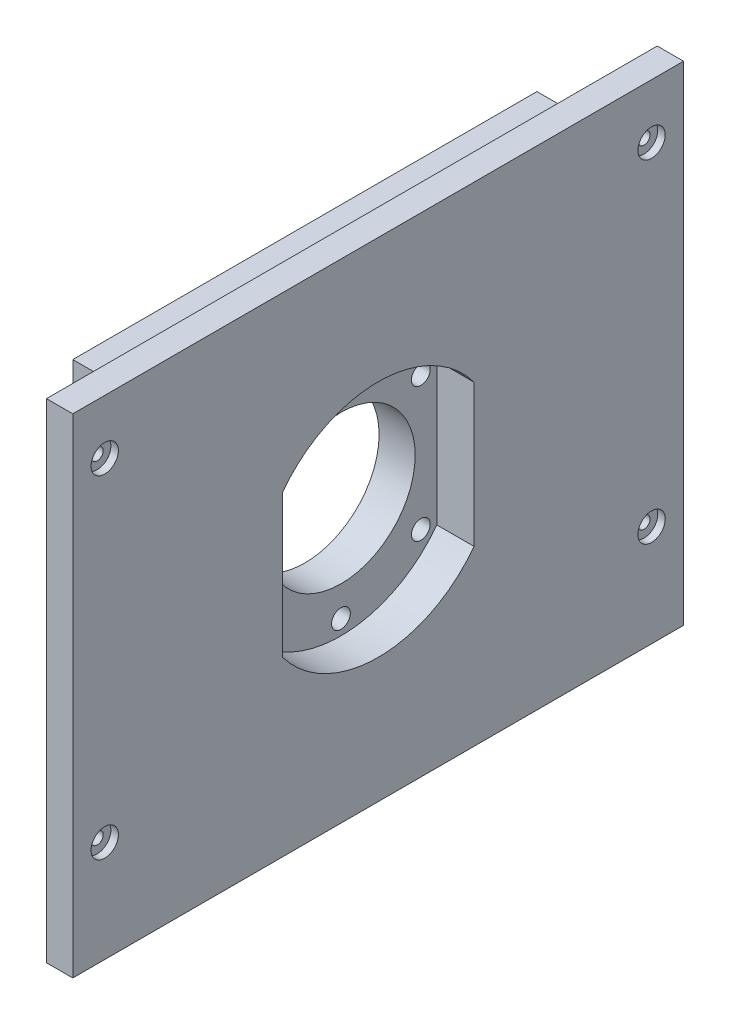
ISO-10303-21;
HEADER;
FILE_DESCRIPTION(('STEP AP214'),'2;1');
FILE_NAME('part.step','',(''),(''),'','','');
FILE_SCHEMA(('AUTOMOTIVE_DESIGN { 1 0 10303 214 1 1 1 1 }'));
ENDSEC;
DATA;
#1=APPLICATION_CONTEXT('core data for automotive mechanical design processes');
#2=APPLICATION_PROTOCOL_DEFINITION('international standard','automotive_design',2000,#1);
#3=PRODUCT_CONTEXT('',#1,'mechanical');
#4=PRODUCT('Part','Part','',(#3));
#5=PRODUCT_RELATED_PRODUCT_CATEGORY('part','',(#4));
#6=PRODUCT_DEFINITION_FORMATION('','',#4);
#7=PRODUCT_DEFINITION_CONTEXT('part definition',#1,'design');
#8=PRODUCT_DEFINITION('design','',#6,#7);
#9=PRODUCT_DEFINITION_SHAPE('','',#8);
#10=(LENGTH_UNIT() NAMED_UNIT(*) SI_UNIT(.MILLI.,.METRE.));
#11=(NAMED_UNIT(*) PLANE_ANGLE_UNIT() SI_UNIT($,.RADIAN.));
#12=(NAMED_UNIT(*) SI_UNIT($,.STERADIAN.) SOLID_ANGLE_UNIT());
#13=UNCERTAINTY_MEASURE_WITH_UNIT(LENGTH_MEASURE(1.E-05),#10,'distance_accuracy_value','');
#14=(GEOMETRIC_REPRESENTATION_CONTEXT(3) GLOBAL_UNCERTAINTY_ASSIGNED_CONTEXT((#13)) GLOBAL_UNIT_ASSIGNED_CONTEXT((#10,
#11,#12)) REPRESENTATION_CONTEXT('',''));
#15=CARTESIAN_POINT('',(0.,0.,0.));
#16=DIRECTION('',(0.,0.,1.));
#17=DIRECTION('',(1.,0.,0.));
#18=AXIS2_PLACEMENT_3D('',#15,#16,#17);
#19=CARTESIAN_POINT('',(39.,130.,150.));
#20=DIRECTION('',(0.,0.,-1.));
#21=DIRECTION('',(-1.,0.,0.));
#22=AXIS2_PLACEMENT_3D('',#19,#20,#21);
#23=PLANE('',#22);
#24=DIRECTION('',(0.,-1.,0.));
#25=VECTOR('',#24,1.);
#26=CARTESIAN_POINT('',(25.,-130.,150.));
#27=LINE('',#26,#25);
#28=CARTESIAN_POINT('',(25.,130.,150.));
#29=VERTEX_POINT('',#28);
#30=CARTESIAN_POINT('',(25.,-130.,150.));
#31=VERTEX_POINT('',#30);
#32=EDGE_CURVE('E191',#29,#31,#27,.T.);
#33=ORIENTED_EDGE('',*,*,#32,.T.);
#34=DIRECTION('',(-1.,0.,0.));
#35=VECTOR('',#34,1.);
#36=CARTESIAN_POINT('',(39.,-130.,150.));
#37=LINE('',#36,#35);
#38=CARTESIAN_POINT('',(39.,-130.,150.));
#39=VERTEX_POINT('',#38);
#40=EDGE_CURVE('E61',#39,#31,#37,.T.);
#41=ORIENTED_EDGE('',*,*,#40,.F.);
#42=DIRECTION('',(0.,-1.,0.));
#43=VECTOR('',#42,1.);
#44=CARTESIAN_POINT('',(39.,130.,150.));
#45=LINE('',#44,#43);
#46=CARTESIAN_POINT('',(39.,130.,150.));
#47=VERTEX_POINT('',#46);
#48=EDGE_CURVE('E304',#47,#39,#45,.T.);
#49=ORIENTED_EDGE('',*,*,#48,.F.);
#50=DIRECTION('',(-1.,0.,0.));
#51=VECTOR('',#50,1.);
#52=CARTESIAN_POINT('',(39.,130.,150.));
#53=LINE('',#52,#51);
#54=EDGE_CURVE('E313',#47,#29,#53,.T.);
#55=ORIENTED_EDGE('',*,*,#54,.T.);
#56=EDGE_LOOP('',(#33,#41,#49,#55));
#57=FACE_BOUND('',#56,.T.);
#58=ADVANCED_FACE('F54',(#57),#23,.F.);
#59=CARTESIAN_POINT('',(39.,-130.,150.));
#60=DIRECTION('',(0.,1.,0.));
#61=DIRECTION('',(0.,0.,1.));
#62=AXIS2_PLACEMENT_3D('',#59,#60,#61);
#63=PLANE('',#62);
#64=ORIENTED_EDGE('',*,*,#40,.T.);
#65=DIRECTION('',(0.,0.,-1.));
#66=VECTOR('',#65,1.);
#67=CARTESIAN_POINT('',(25.,-130.,-175.));
#68=LINE('',#67,#66);
#69=CARTESIAN_POINT('',(25.,-130.,-175.));
#70=VERTEX_POINT('',#69);
#71=EDGE_CURVE('E195',#31,#70,#68,.T.);
#72=ORIENTED_EDGE('',*,*,#71,.T.);
#73=DIRECTION('',(-1.,0.,0.));
#74=VECTOR('',#73,1.);
#75=CARTESIAN_POINT('',(39.,-130.,-175.));
#76=LINE('',#75,#74);
#77=CARTESIAN_POINT('',(39.,-130.,-175.));
#78=VERTEX_POINT('',#77);
#79=EDGE_CURVE('E319',#78,#70,#76,.T.);
#80=ORIENTED_EDGE('',*,*,#79,.F.);
#81=DIRECTION('',(0.,0.,-1.));
#82=VECTOR('',#81,1.);
#83=CARTESIAN_POINT('',(39.,-130.,150.));
#84=LINE('',#83,#82);
#85=EDGE_CURVE('E307',#39,#78,#84,.T.);
#86=ORIENTED_EDGE('',*,*,#85,.F.);
#87=EDGE_LOOP('',(#64,#72,#80,#86));
#88=FACE_BOUND('',#87,.T.);
#89=ADVANCED_FACE('F364',(#88),#63,.F.);
#90=CARTESIAN_POINT('',(39.,130.,150.));
#91=DIRECTION('',(0.,-1.,0.));
#92=DIRECTION('',(0.,0.,-1.));
#93=AXIS2_PLACEMENT_3D('',#90,#91,#92);
#94=PLANE('',#93);
#95=DIRECTION('',(0.,0.,1.));
#96=VECTOR('',#95,1.);
#97=CARTESIAN_POINT('',(25.,130.,-175.));
#98=LINE('',#97,#96);
#99=CARTESIAN_POINT('',(25.,130.,-175.));
#100=VERTEX_POINT('',#99);
#101=EDGE_CURVE('E188',#100,#29,#98,.T.);
#102=ORIENTED_EDGE('',*,*,#101,.T.);
#103=ORIENTED_EDGE('',*,*,#54,.F.);
#104=DIRECTION('',(0.,0.,1.));
#105=VECTOR('',#104,1.);
#106=CARTESIAN_POINT('',(39.,130.,150.));
#107=LINE('',#106,#105);
#108=CARTESIAN_POINT('',(39.,130.,-175.));
#109=VERTEX_POINT('',#108);
#110=EDGE_CURVE('E311',#109,#47,#107,.T.);
#111=ORIENTED_EDGE('',*,*,#110,.F.);
#112=DIRECTION('',(-1.,0.,0.));
#113=VECTOR('',#112,1.);
#114=CARTESIAN_POINT('',(39.,130.,-175.));
#115=LINE('',#114,#113);
#116=EDGE_CURVE('E316',#109,#100,#115,.T.);
#117=ORIENTED_EDGE('',*,*,#116,.T.);
#118=EDGE_LOOP('',(#102,#103,#111,#117));
#119=FACE_BOUND('',#118,.T.);
#120=ADVANCED_FACE('F371',(#119),#94,.F.);
#121=CARTESIAN_POINT('',(0.,0.,0.));
#122=DIRECTION('',(1.,0.,0.));
#123=DIRECTION('',(0.,0.,-1.));
#124=AXIS2_PLACEMENT_3D('',#121,#122,#123);
#125=PLANE('',#124);
#126=CARTESIAN_POINT('',(0.,0.,-12.5));
#127=DIRECTION('',(1.,0.,0.));
#128=DIRECTION('',(0.,0.,-1.));
#129=AXIS2_PLACEMENT_3D('',#126,#127,#128);
#130=CIRCLE('',#129,39.51);
#131=CARTESIAN_POINT('',(0.,0.,-52.01));
#132=VERTEX_POINT('',#131);
#133=EDGE_CURVE('E265',#132,#132,#130,.T.);
#134=ORIENTED_EDGE('',*,*,#133,.T.);
#135=EDGE_LOOP('',(#134));
#136=FACE_BOUND('',#135,.T.);
#137=DIRECTION('',(0.,1.,0.));
#138=VECTOR('',#137,1.);
#139=CARTESIAN_POINT('',(0.,-130.,111.));
#140=LINE('',#139,#138);
#141=CARTESIAN_POINT('',(0.,-116.,111.));
#142=VERTEX_POINT('',#141);
#143=CARTESIAN_POINT('',(0.,116.,111.));
#144=VERTEX_POINT('',#143);
#145=EDGE_CURVE('E180',#142,#144,#140,.T.);
#146=ORIENTED_EDGE('',*,*,#145,.T.);
#147=DIRECTION('',(0.,0.,1.));
#148=VECTOR('',#147,1.);
#149=CARTESIAN_POINT('',(0.,116.,-175.));
#150=LINE('',#149,#148);
#151=CARTESIAN_POINT('',(0.,116.,-136.));
#152=VERTEX_POINT('',#151);
#153=EDGE_CURVE('E67',#152,#144,#150,.T.);
#154=ORIENTED_EDGE('',*,*,#153,.F.);
#155=DIRECTION('',(0.,-1.,0.));
#156=VECTOR('',#155,1.);
#157=CARTESIAN_POINT('',(0.,-130.,-136.));
#158=LINE('',#157,#156);
#159=CARTESIAN_POINT('',(0.,-116.,-136.));
#160=VERTEX_POINT('',#159);
#161=EDGE_CURVE('E177',#152,#160,#158,.T.);
#162=ORIENTED_EDGE('',*,*,#161,.T.);
#163=DIRECTION('',(0.,0.,-1.));
#164=VECTOR('',#163,1.);
#165=CARTESIAN_POINT('',(0.,-116.,-136.));
#166=LINE('',#165,#164);
#167=EDGE_CURVE('E394',#142,#160,#166,.T.);
#168=ORIENTED_EDGE('',*,*,#167,.F.);
#169=EDGE_LOOP('',(#146,#154,#162,#168));
#170=FACE_BOUND('',#169,.T.);
#171=ADVANCED_FACE('F175',(#136,#170),#125,.F.);
#172=CARTESIAN_POINT('',(39.,-76.,133.));
#173=DIRECTION('',(1.,0.,0.));
#174=DIRECTION('',(0.,0.,-1.));
#175=AXIS2_PLACEMENT_3D('',#172,#173,#174);
#176=CYLINDRICAL_SURFACE('',#175,3.19999999999999);
#177=CARTESIAN_POINT('',(35.,-76.,133.));
#178=DIRECTION('',(1.,0.,0.));
#179=DIRECTION('',(0.,0.,-1.));
#180=AXIS2_PLACEMENT_3D('',#177,#178,#179);
#181=CIRCLE('',#180,3.19999999999999);
#182=CARTESIAN_POINT('',(35.,-76.,129.8));
#183=VERTEX_POINT('',#182);
#184=EDGE_CURVE('E301',#183,#183,#181,.T.);
#185=ORIENTED_EDGE('',*,*,#184,.T.);
#186=EDGE_LOOP('',(#185));
#187=FACE_BOUND('',#186,.T.);
#188=CARTESIAN_POINT('',(25.,-76.,133.));
#189=DIRECTION('',(-1.,0.,0.));
#190=DIRECTION('',(0.,0.,1.));
#191=AXIS2_PLACEMENT_3D('',#188,#189,#190);
#192=CIRCLE('',#191,3.19999999999999);
#193=CARTESIAN_POINT('',(25.,-76.,136.2));
#194=VERTEX_POINT('',#193);
#195=EDGE_CURVE('E205',#194,#194,#192,.F.);
#196=ORIENTED_EDGE('',*,*,#195,.F.);
#197=EDGE_LOOP('',(#196));
#198=FACE_BOUND('',#197,.T.);
#199=ADVANCED_FACE('F348',(#187,#198),#176,.F.);
#200=CARTESIAN_POINT('',(39.,101.,133.));
#201=DIRECTION('',(1.,0.,0.));
#202=DIRECTION('',(0.,0.,-1.));
#203=AXIS2_PLACEMENT_3D('',#200,#201,#202);
#204=CYLINDRICAL_SURFACE('',#203,3.19999999999999);
#205=CARTESIAN_POINT('',(35.,101.,133.));
#206=DIRECTION('',(1.,0.,0.));
#207=DIRECTION('',(0.,0.,-1.));
#208=AXIS2_PLACEMENT_3D('',#205,#206,#207);
#209=CIRCLE('',#208,3.19999999999999);
#210=CARTESIAN_POINT('',(35.,101.,129.8));
#211=VERTEX_POINT('',#210);
#212=EDGE_CURVE('E292',#211,#211,#209,.T.);
#213=ORIENTED_EDGE('',*,*,#212,.T.);
#214=EDGE_LOOP('',(#213));
#215=FACE_BOUND('',#214,.T.);
#216=CARTESIAN_POINT('',(25.,101.,133.));
#217=DIRECTION('',(-1.,0.,0.));
#218=DIRECTION('',(0.,0.,1.));
#219=AXIS2_PLACEMENT_3D('',#216,#217,#218);
#220=CIRCLE('',#219,3.19999999999999);
#221=CARTESIAN_POINT('',(25.,101.,136.2));
#222=VERTEX_POINT('',#221);
#223=EDGE_CURVE('E203',#222,#222,#220,.F.);
#224=ORIENTED_EDGE('',*,*,#223,.F.);
#225=EDGE_LOOP('',(#224));
#226=FACE_BOUND('',#225,.T.);
#227=ADVANCED_FACE('F345',(#215,#226),#204,.F.);
#228=CARTESIAN_POINT('',(39.,130.,-175.));
#229=DIRECTION('',(0.,0.,1.));
#230=DIRECTION('',(1.,0.,0.));
#231=AXIS2_PLACEMENT_3D('',#228,#229,#230);
#232=PLANE('',#231);
#233=ORIENTED_EDGE('',*,*,#79,.T.);
#234=DIRECTION('',(0.,1.,0.));
#235=VECTOR('',#234,1.);
#236=CARTESIAN_POINT('',(25.,-130.,-175.));
#237=LINE('',#236,#235);
#238=EDGE_CURVE('E185',#70,#100,#237,.T.);
#239=ORIENTED_EDGE('',*,*,#238,.T.);
#240=ORIENTED_EDGE('',*,*,#116,.F.);
#241=DIRECTION('',(0.,1.,0.));
#242=VECTOR('',#241,1.);
#243=CARTESIAN_POINT('',(39.,130.,-175.));
#244=LINE('',#243,#242);
#245=EDGE_CURVE('E309',#78,#109,#244,.T.);
#246=ORIENTED_EDGE('',*,*,#245,.F.);
#247=EDGE_LOOP('',(#233,#239,#240,#246));
#248=FACE_BOUND('',#247,.T.);
#249=ADVANCED_FACE('F347',(#248),#232,.F.);
#250=CARTESIAN_POINT('',(39.,0.,0.));
#251=DIRECTION('',(1.,0.,0.));
#252=DIRECTION('',(0.,0.,-1.));
#253=AXIS2_PLACEMENT_3D('',#250,#251,#252);
#254=PLANE('',#253);
#255=CARTESIAN_POINT('',(39.,0.0181351239460711,-12.5));
#256=DIRECTION('',(1.,0.,0.));
#257=DIRECTION('',(0.,0.,1.));
#258=AXIS2_PLACEMENT_3D('',#255,#256,#257);
#259=CIRCLE('',#258,63.5);
#260=CARTESIAN_POINT('',(39.,37.85,-63.5));
#261=VERTEX_POINT('',#260);
#262=CARTESIAN_POINT('',(39.,37.85,38.5));
#263=VERTEX_POINT('',#262);
#264=EDGE_CURVE('E246',#261,#263,#259,.T.);
#265=ORIENTED_EDGE('',*,*,#264,.F.);
#266=DIRECTION('',(0.,1.,0.));
#267=VECTOR('',#266,1.);
#268=CARTESIAN_POINT('',(39.,37.85,-63.5));
#269=LINE('',#268,#267);
#270=CARTESIAN_POINT('',(39.,-37.85,-63.5));
#271=VERTEX_POINT('',#270);
#272=EDGE_CURVE('E236',#271,#261,#269,.T.);
#273=ORIENTED_EDGE('',*,*,#272,.F.);
#274=CARTESIAN_POINT('',(39.,-0.0181351239460711,-12.5));
#275=DIRECTION('',(1.,0.,0.));
#276=DIRECTION('',(0.,0.,-1.));
#277=AXIS2_PLACEMENT_3D('',#274,#275,#276);
#278=CIRCLE('',#277,63.5);
#279=CARTESIAN_POINT('',(39.,-37.85,38.5));
#280=VERTEX_POINT('',#279);
#281=EDGE_CURVE('E251',#280,#271,#278,.T.);
#282=ORIENTED_EDGE('',*,*,#281,.F.);
#283=DIRECTION('',(0.,-1.,0.));
#284=VECTOR('',#283,1.);
#285=CARTESIAN_POINT('',(39.,37.85,38.5));
#286=LINE('',#285,#284);
#287=EDGE_CURVE('E248',#263,#280,#286,.T.);
#288=ORIENTED_EDGE('',*,*,#287,.F.);
#289=EDGE_LOOP('',(#265,#273,#282,#288));
#290=FACE_BOUND('',#289,.T.);
#291=CARTESIAN_POINT('',(39.,101.,-158.));
#292=DIRECTION('',(1.,0.,0.));
#293=DIRECTION('',(0.,0.,-1.));
#294=AXIS2_PLACEMENT_3D('',#291,#292,#293);
#295=CIRCLE('',#294,7.2735);
#296=CARTESIAN_POINT('',(39.,101.,-165.2735));
#297=VERTEX_POINT('',#296);
#298=EDGE_CURVE('E268',#297,#297,#295,.T.);
#299=ORIENTED_EDGE('',*,*,#298,.F.);
#300=EDGE_LOOP('',(#299));
#301=FACE_BOUND('',#300,.T.);
#302=CARTESIAN_POINT('',(39.,-76.,-158.));
#303=DIRECTION('',(1.,0.,0.));
#304=DIRECTION('',(0.,0.,-1.));
#305=AXIS2_PLACEMENT_3D('',#302,#303,#304);
#306=CIRCLE('',#305,7.2735);
#307=CARTESIAN_POINT('',(39.,-76.,-165.2735));
#308=VERTEX_POINT('',#307);
#309=EDGE_CURVE('E277',#308,#308,#306,.T.);
#310=ORIENTED_EDGE('',*,*,#309,.F.);
#311=EDGE_LOOP('',(#310));
#312=FACE_BOUND('',#311,.T.);
#313=CARTESIAN_POINT('',(39.,101.,133.));
#314=DIRECTION('',(1.,0.,0.));
#315=DIRECTION('',(0.,0.,-1.));
#316=AXIS2_PLACEMENT_3D('',#313,#314,#315);
#317=CIRCLE('',#316,7.2735);
#318=CARTESIAN_POINT('',(39.,101.,125.7265));
#319=VERTEX_POINT('',#318);
#320=EDGE_CURVE('E286',#319,#319,#317,.T.);
#321=ORIENTED_EDGE('',*,*,#320,.F.);
#322=EDGE_LOOP('',(#321));
#323=FACE_BOUND('',#322,.T.);
#324=CARTESIAN_POINT('',(39.,-76.,133.));
#325=DIRECTION('',(1.,0.,0.));
#326=DIRECTION('',(0.,0.,-1.));
#327=AXIS2_PLACEMENT_3D('',#324,#325,#326);
#328=CIRCLE('',#327,7.2735);
#329=CARTESIAN_POINT('',(39.,-76.,125.7265));
#330=VERTEX_POINT('',#329);
#331=EDGE_CURVE('E295',#330,#330,#328,.T.);
#332=ORIENTED_EDGE('',*,*,#331,.F.);
#333=EDGE_LOOP('',(#332));
#334=FACE_BOUND('',#333,.T.);
#335=ORIENTED_EDGE('',*,*,#48,.T.);
#336=ORIENTED_EDGE('',*,*,#85,.T.);
#337=ORIENTED_EDGE('',*,*,#245,.T.);
#338=ORIENTED_EDGE('',*,*,#110,.T.);
#339=EDGE_LOOP('',(#335,#336,#337,#338));
#340=FACE_BOUND('',#339,.T.);
#341=ADVANCED_FACE('F356',(#290,#301,#312,#323,#334,#340),#254,.T.);
#342=CARTESIAN_POINT('',(35.,-72.8,133.));
#343=DIRECTION('',(-1.,0.,0.));
#344=DIRECTION('',(0.,0.,1.));
#345=AXIS2_PLACEMENT_3D('',#342,#343,#344);
#346=PLANE('',#345);
#347=ORIENTED_EDGE('',*,*,#184,.F.);
#348=EDGE_LOOP('',(#347));
#349=FACE_BOUND('',#348,.T.);
#350=CARTESIAN_POINT('',(35.,-76.,133.));
#351=DIRECTION('',(1.,0.,0.));
#352=DIRECTION('',(0.,0.,-1.));
#353=AXIS2_PLACEMENT_3D('',#350,#351,#352);
#354=CIRCLE('',#353,7.2735);
#355=CARTESIAN_POINT('',(35.,-76.,125.7265));
#356=VERTEX_POINT('',#355);
#357=EDGE_CURVE('E298',#356,#356,#354,.T.);
#358=ORIENTED_EDGE('',*,*,#357,.T.);
#359=EDGE_LOOP('',(#358));
#360=FACE_BOUND('',#359,.T.);
#361=ADVANCED_FACE('F540',(#349,#360),#346,.F.);
#362=CARTESIAN_POINT('',(39.,-76.,133.));
#363=DIRECTION('',(1.,0.,0.));
#364=DIRECTION('',(0.,0.,-1.));
#365=AXIS2_PLACEMENT_3D('',#362,#363,#364);
#366=CYLINDRICAL_SURFACE('',#365,7.2735);
#367=ORIENTED_EDGE('',*,*,#357,.F.);
#368=EDGE_LOOP('',(#367));
#369=FACE_BOUND('',#368,.T.);
#370=ORIENTED_EDGE('',*,*,#331,.T.);
#371=EDGE_LOOP('',(#370));
#372=FACE_BOUND('',#371,.T.);
#373=ADVANCED_FACE('F535',(#369,#372),#366,.F.);
#374=CARTESIAN_POINT('',(35.,104.2,133.));
#375=DIRECTION('',(-1.,0.,0.));
#376=DIRECTION('',(0.,0.,1.));
#377=AXIS2_PLACEMENT_3D('',#374,#375,#376);
#378=PLANE('',#377);
#379=ORIENTED_EDGE('',*,*,#212,.F.);
#380=EDGE_LOOP('',(#379));
#381=FACE_BOUND('',#380,.T.);
#382=CARTESIAN_POINT('',(35.,101.,133.));
#383=DIRECTION('',(1.,0.,0.));
#384=DIRECTION('',(0.,0.,-1.));
#385=AXIS2_PLACEMENT_3D('',#382,#383,#384);
#386=CIRCLE('',#385,7.2735);
#387=CARTESIAN_POINT('',(35.,101.,125.7265));
#388=VERTEX_POINT('',#387);
#389=EDGE_CURVE('E289',#388,#388,#386,.T.);
#390=ORIENTED_EDGE('',*,*,#389,.T.);
#391=EDGE_LOOP('',(#390));
#392=FACE_BOUND('',#391,.T.);
#393=ADVANCED_FACE('F532',(#381,#392),#378,.F.);
#394=CARTESIAN_POINT('',(39.,101.,133.));
#395=DIRECTION('',(1.,0.,0.));
#396=DIRECTION('',(0.,0.,-1.));
#397=AXIS2_PLACEMENT_3D('',#394,#395,#396);
#398=CYLINDRICAL_SURFACE('',#397,7.2735);
#399=ORIENTED_EDGE('',*,*,#389,.F.);
#400=EDGE_LOOP('',(#399));
#401=FACE_BOUND('',#400,.T.);
#402=ORIENTED_EDGE('',*,*,#320,.T.);
#403=EDGE_LOOP('',(#402));
#404=FACE_BOUND('',#403,.T.);
#405=ADVANCED_FACE('F529',(#401,#404),#398,.F.);
#406=CARTESIAN_POINT('',(39.,-76.,-158.));
#407=DIRECTION('',(1.,0.,0.));
#408=DIRECTION('',(0.,0.,-1.));
#409=AXIS2_PLACEMENT_3D('',#406,#407,#408);
#410=CYLINDRICAL_SURFACE('',#409,3.19999999999999);
#411=CARTESIAN_POINT('',(25.,-76.,-158.));
#412=DIRECTION('',(1.,0.,0.));
#413=DIRECTION('',(0.,0.,-1.));
#414=AXIS2_PLACEMENT_3D('',#411,#412,#413);
#415=CIRCLE('',#414,3.19999999999999);
#416=CARTESIAN_POINT('',(25.,-76.,-161.2));
#417=VERTEX_POINT('',#416);
#418=EDGE_CURVE('E200',#417,#417,#415,.F.);
#419=ORIENTED_EDGE('',*,*,#418,.T.);
#420=EDGE_LOOP('',(#419));
#421=FACE_BOUND('',#420,.T.);
#422=CARTESIAN_POINT('',(35.,-76.,-158.));
#423=DIRECTION('',(1.,0.,0.));
#424=DIRECTION('',(0.,0.,-1.));
#425=AXIS2_PLACEMENT_3D('',#422,#423,#424);
#426=CIRCLE('',#425,3.19999999999999);
#427=CARTESIAN_POINT('',(35.,-76.,-161.2));
#428=VERTEX_POINT('',#427);
#429=EDGE_CURVE('E283',#428,#428,#426,.T.);
#430=ORIENTED_EDGE('',*,*,#429,.T.);
#431=EDGE_LOOP('',(#430));
#432=FACE_BOUND('',#431,.T.);
#433=ADVANCED_FACE('F525',(#421,#432),#410,.F.);
#434=CARTESIAN_POINT('',(35.,-72.8,-158.));
#435=DIRECTION('',(-1.,0.,0.));
#436=DIRECTION('',(0.,0.,1.));
#437=AXIS2_PLACEMENT_3D('',#434,#435,#436);
#438=PLANE('',#437);
#439=ORIENTED_EDGE('',*,*,#429,.F.);
#440=EDGE_LOOP('',(#439));
#441=FACE_BOUND('',#440,.T.);
#442=CARTESIAN_POINT('',(35.,-76.,-158.));
#443=DIRECTION('',(1.,0.,0.));
#444=DIRECTION('',(0.,0.,-1.));
#445=AXIS2_PLACEMENT_3D('',#442,#443,#444);
#446=CIRCLE('',#445,7.2735);
#447=CARTESIAN_POINT('',(35.,-76.,-165.2735));
#448=VERTEX_POINT('',#447);
#449=EDGE_CURVE('E280',#448,#448,#446,.T.);
#450=ORIENTED_EDGE('',*,*,#449,.T.);
#451=EDGE_LOOP('',(#450));
#452=FACE_BOUND('',#451,.T.);
#453=ADVANCED_FACE('F521',(#441,#452),#438,.F.);
#454=CARTESIAN_POINT('',(39.,-76.,-158.));
#455=DIRECTION('',(1.,0.,0.));
#456=DIRECTION('',(0.,0.,-1.));
#457=AXIS2_PLACEMENT_3D('',#454,#455,#456);
#458=CYLINDRICAL_SURFACE('',#457,7.2735);
#459=ORIENTED_EDGE('',*,*,#449,.F.);
#460=EDGE_LOOP('',(#459));
#461=FACE_BOUND('',#460,.T.);
#462=ORIENTED_EDGE('',*,*,#309,.T.);
#463=EDGE_LOOP('',(#462));
#464=FACE_BOUND('',#463,.T.);
#465=ADVANCED_FACE('F517',(#461,#464),#458,.F.);
#466=CARTESIAN_POINT('',(39.,101.,-158.));
#467=DIRECTION('',(1.,0.,0.));
#468=DIRECTION('',(0.,0.,-1.));
#469=AXIS2_PLACEMENT_3D('',#466,#467,#468);
#470=CYLINDRICAL_SURFACE('',#469,3.19999999999999);
#471=CARTESIAN_POINT('',(25.,101.,-158.));
#472=DIRECTION('',(1.,0.,0.));
#473=DIRECTION('',(0.,0.,-1.));
#474=AXIS2_PLACEMENT_3D('',#471,#472,#473);
#475=CIRCLE('',#474,3.19999999999999);
#476=CARTESIAN_POINT('',(25.,101.,-161.2));
#477=VERTEX_POINT('',#476);
#478=EDGE_CURVE('E204',#477,#477,#475,.F.);
#479=ORIENTED_EDGE('',*,*,#478,.T.);
#480=EDGE_LOOP('',(#479));
#481=FACE_BOUND('',#480,.T.);
#482=CARTESIAN_POINT('',(35.,101.,-158.));
#483=DIRECTION('',(1.,0.,0.));
#484=DIRECTION('',(0.,0.,-1.));
#485=AXIS2_PLACEMENT_3D('',#482,#483,#484);
#486=CIRCLE('',#485,3.19999999999999);
#487=CARTESIAN_POINT('',(35.,101.,-161.2));
#488=VERTEX_POINT('',#487);
#489=EDGE_CURVE('E274',#488,#488,#486,.T.);
#490=ORIENTED_EDGE('',*,*,#489,.T.);
#491=EDGE_LOOP('',(#490));
#492=FACE_BOUND('',#491,.T.);
#493=ADVANCED_FACE('F513',(#481,#492),#470,.F.);
#494=CARTESIAN_POINT('',(35.,104.2,-158.));
#495=DIRECTION('',(-1.,0.,0.));
#496=DIRECTION('',(0.,0.,1.));
#497=AXIS2_PLACEMENT_3D('',#494,#495,#496);
#498=PLANE('',#497);
#499=ORIENTED_EDGE('',*,*,#489,.F.);
#500=EDGE_LOOP('',(#499));
#501=FACE_BOUND('',#500,.T.);
#502=CARTESIAN_POINT('',(35.,101.,-158.));
#503=DIRECTION('',(1.,0.,0.));
#504=DIRECTION('',(0.,0.,-1.));
#505=AXIS2_PLACEMENT_3D('',#502,#503,#504);
#506=CIRCLE('',#505,7.2735);
#507=CARTESIAN_POINT('',(35.,101.,-165.2735));
#508=VERTEX_POINT('',#507);
#509=EDGE_CURVE('E271',#508,#508,#506,.T.);
#510=ORIENTED_EDGE('',*,*,#509,.T.);
#511=EDGE_LOOP('',(#510));
#512=FACE_BOUND('',#511,.T.);
#513=ADVANCED_FACE('F509',(#501,#512),#498,.F.);
#514=CARTESIAN_POINT('',(39.,101.,-158.));
#515=DIRECTION('',(1.,0.,0.));
#516=DIRECTION('',(0.,0.,-1.));
#517=AXIS2_PLACEMENT_3D('',#514,#515,#516);
#518=CYLINDRICAL_SURFACE('',#517,7.2735);
#519=ORIENTED_EDGE('',*,*,#509,.F.);
#520=EDGE_LOOP('',(#519));
#521=FACE_BOUND('',#520,.T.);
#522=ORIENTED_EDGE('',*,*,#298,.T.);
#523=EDGE_LOOP('',(#522));
#524=FACE_BOUND('',#523,.T.);
#525=ADVANCED_FACE('F505',(#521,#524),#518,.F.);
#526=CARTESIAN_POINT('',(0.,0.,-12.5));
#527=DIRECTION('',(1.,0.,0.));
#528=DIRECTION('',(0.,0.,-1.));
#529=AXIS2_PLACEMENT_3D('',#526,#527,#528);
#530=CYLINDRICAL_SURFACE('',#529,39.51);
#531=CARTESIAN_POINT('',(19.2,0.,-12.5));
#532=DIRECTION('',(-1.,0.,0.));
#533=DIRECTION('',(0.,0.,1.));
#534=AXIS2_PLACEMENT_3D('',#531,#532,#533);
#535=CIRCLE('',#534,39.51);
#536=CARTESIAN_POINT('',(19.2,0.,27.01));
#537=VERTEX_POINT('',#536);
#538=EDGE_CURVE('E258',#537,#537,#535,.F.);
#539=ORIENTED_EDGE('',*,*,#538,.T.);
#540=EDGE_LOOP('',(#539));
#541=FACE_BOUND('',#540,.T.);
#542=ORIENTED_EDGE('',*,*,#133,.F.);
#543=EDGE_LOOP('',(#542));
#544=FACE_BOUND('',#543,.T.);
#545=ADVANCED_FACE('F487',(#541,#544),#530,.F.);
#546=CARTESIAN_POINT('',(19.2,0.0181351239460711,-12.5));
#547=DIRECTION('',(-1.,0.,0.));
#548=DIRECTION('',(0.,0.,1.));
#549=AXIS2_PLACEMENT_3D('',#546,#547,#548);
#550=PLANE('',#549);
#551=CARTESIAN_POINT('',(19.2,55.5,-12.5));
#552=DIRECTION('',(-1.,0.,0.));
#553=DIRECTION('',(0.,0.,1.));
#554=AXIS2_PLACEMENT_3D('',#551,#552,#553);
#555=CIRCLE('',#554,4.99999999999999);
#556=CARTESIAN_POINT('',(19.2,55.5,-7.50000000000002));
#557=VERTEX_POINT('',#556);
#558=EDGE_CURVE('E211',#557,#557,#555,.T.);
#559=ORIENTED_EDGE('',*,*,#558,.T.);
#560=EDGE_LOOP('',(#559));
#561=FACE_BOUND('',#560,.T.);
#562=CARTESIAN_POINT('',(19.2,35.6747123376029,-55.0154665931034));
#563=DIRECTION('',(-1.,0.,0.));
#564=DIRECTION('',(0.,0.,1.));
#565=AXIS2_PLACEMENT_3D('',#562,#563,#564);
#566=CIRCLE('',#565,4.99999999999999);
#567=CARTESIAN_POINT('',(19.2,35.6747123376029,-50.0154665931034));
#568=VERTEX_POINT('',#567);
#569=EDGE_CURVE('E215',#568,#568,#566,.T.);
#570=ORIENTED_EDGE('',*,*,#569,.T.);
#571=EDGE_LOOP('',(#570));
#572=FACE_BOUND('',#571,.T.);
#573=CARTESIAN_POINT('',(19.2,35.6747123376028,30.0154665931034));
#574=DIRECTION('',(-1.,0.,0.));
#575=DIRECTION('',(0.,0.,1.));
#576=AXIS2_PLACEMENT_3D('',#573,#574,#575);
#577=CIRCLE('',#576,4.99999999999999);
#578=CARTESIAN_POINT('',(19.2,35.6747123376028,35.0154665931034));
#579=VERTEX_POINT('',#578);
#580=EDGE_CURVE('E219',#579,#579,#577,.T.);
#581=ORIENTED_EDGE('',*,*,#580,.T.);
#582=EDGE_LOOP('',(#581));
#583=FACE_BOUND('',#582,.T.);
#584=CARTESIAN_POINT('',(19.2,-35.6747123376029,30.0154665931033));
#585=DIRECTION('',(-1.,0.,0.));
#586=DIRECTION('',(0.,0.,1.));
#587=AXIS2_PLACEMENT_3D('',#584,#585,#586);
#588=CIRCLE('',#587,5.);
#589=CARTESIAN_POINT('',(19.2,-35.6747123376029,35.0154665931033));
#590=VERTEX_POINT('',#589);
#591=EDGE_CURVE('E223',#590,#590,#588,.T.);
#592=ORIENTED_EDGE('',*,*,#591,.T.);
#593=EDGE_LOOP('',(#592));
#594=FACE_BOUND('',#593,.T.);
#595=CARTESIAN_POINT('',(19.2,-55.5,-12.5));
#596=DIRECTION('',(-1.,0.,0.));
#597=DIRECTION('',(0.,0.,1.));
#598=AXIS2_PLACEMENT_3D('',#595,#596,#597);
#599=CIRCLE('',#598,4.99999999999999);
#600=CARTESIAN_POINT('',(19.2,-55.5,-7.50000000000002));
#601=VERTEX_POINT('',#600);
#602=EDGE_CURVE('E227',#601,#601,#599,.T.);
#603=ORIENTED_EDGE('',*,*,#602,.T.);
#604=EDGE_LOOP('',(#603));
#605=FACE_BOUND('',#604,.T.);
#606=CARTESIAN_POINT('',(19.2,-35.6747123376028,-55.0154665931034));
#607=DIRECTION('',(-1.,0.,0.));
#608=DIRECTION('',(0.,0.,1.));
#609=AXIS2_PLACEMENT_3D('',#606,#607,#608);
#610=CIRCLE('',#609,5.);
#611=CARTESIAN_POINT('',(19.2,-35.6747123376028,-50.0154665931034));
#612=VERTEX_POINT('',#611);
#613=EDGE_CURVE('E231',#612,#612,#610,.T.);
#614=ORIENTED_EDGE('',*,*,#613,.T.);
#615=EDGE_LOOP('',(#614));
#616=FACE_BOUND('',#615,.T.);
#617=CARTESIAN_POINT('',(19.2,0.0181351239460711,-12.5));
#618=DIRECTION('',(1.,0.,0.));
#619=DIRECTION('',(0.,0.,1.));
#620=AXIS2_PLACEMENT_3D('',#617,#618,#619);
#621=CIRCLE('',#620,63.5);
#622=CARTESIAN_POINT('',(19.2,37.85,-63.5));
#623=VERTEX_POINT('',#622);
#624=CARTESIAN_POINT('',(19.2,37.85,38.5));
#625=VERTEX_POINT('',#624);
#626=EDGE_CURVE('E232',#623,#625,#621,.T.);
#627=ORIENTED_EDGE('',*,*,#626,.T.);
#628=DIRECTION('',(0.,-1.,0.));
#629=VECTOR('',#628,1.);
#630=CARTESIAN_POINT('',(19.2,37.85,38.5));
#631=LINE('',#630,#629);
#632=CARTESIAN_POINT('',(19.2,-37.85,38.5));
#633=VERTEX_POINT('',#632);
#634=EDGE_CURVE('E235',#625,#633,#631,.T.);
#635=ORIENTED_EDGE('',*,*,#634,.T.);
#636=CARTESIAN_POINT('',(19.2,-0.0181351239460711,-12.5));
#637=DIRECTION('',(1.,0.,0.));
#638=DIRECTION('',(0.,0.,-1.));
#639=AXIS2_PLACEMENT_3D('',#636,#637,#638);
#640=CIRCLE('',#639,63.5);
#641=CARTESIAN_POINT('',(19.2,-37.85,-63.5));
#642=VERTEX_POINT('',#641);
#643=EDGE_CURVE('E239',#633,#642,#640,.T.);
#644=ORIENTED_EDGE('',*,*,#643,.T.);
#645=DIRECTION('',(0.,1.,0.));
#646=VECTOR('',#645,1.);
#647=CARTESIAN_POINT('',(19.2,37.85,-63.5));
#648=LINE('',#647,#646);
#649=EDGE_CURVE('E242',#642,#623,#648,.T.);
#650=ORIENTED_EDGE('',*,*,#649,.T.);
#651=EDGE_LOOP('',(#627,#635,#644,#650));
#652=FACE_BOUND('',#651,.T.);
#653=ORIENTED_EDGE('',*,*,#538,.F.);
#654=EDGE_LOOP('',(#653));
#655=FACE_BOUND('',#654,.T.);
#656=ADVANCED_FACE('F483',(#561,#572,#583,#594,#605,#616,#652,#655),#550,.F.);
#657=CARTESIAN_POINT('',(19.2,0.0181351239460711,-12.5));
#658=DIRECTION('',(1.,0.,0.));
#659=DIRECTION('',(0.,0.,-1.));
#660=AXIS2_PLACEMENT_3D('',#657,#658,#659);
#661=CYLINDRICAL_SURFACE('',#660,63.5);
#662=ORIENTED_EDGE('',*,*,#264,.T.);
#663=DIRECTION('',(1.,0.,0.));
#664=VECTOR('',#663,1.);
#665=CARTESIAN_POINT('',(19.2,37.85,38.5));
#666=LINE('',#665,#664);
#667=EDGE_CURVE('E245',#625,#263,#666,.T.);
#668=ORIENTED_EDGE('',*,*,#667,.F.);
#669=ORIENTED_EDGE('',*,*,#626,.F.);
#670=DIRECTION('',(1.,0.,0.));
#671=VECTOR('',#670,1.);
#672=CARTESIAN_POINT('',(19.2,37.85,-63.5));
#673=LINE('',#672,#671);
#674=EDGE_CURVE('E256',#623,#261,#673,.T.);
#675=ORIENTED_EDGE('',*,*,#674,.T.);
#676=EDGE_LOOP('',(#662,#668,#669,#675));
#677=FACE_BOUND('',#676,.T.);
#678=ADVANCED_FACE('F486',(#677),#661,.F.);
#679=CARTESIAN_POINT('',(19.2,37.85,-63.5));
#680=DIRECTION('',(0.,0.,-1.));
#681=DIRECTION('',(0.,1.,0.));
#682=AXIS2_PLACEMENT_3D('',#679,#680,#681);
#683=PLANE('',#682);
#684=ORIENTED_EDGE('',*,*,#272,.T.);
#685=ORIENTED_EDGE('',*,*,#674,.F.);
#686=ORIENTED_EDGE('',*,*,#649,.F.);
#687=DIRECTION('',(1.,0.,0.));
#688=VECTOR('',#687,1.);
#689=CARTESIAN_POINT('',(19.2,-37.85,-63.5));
#690=LINE('',#689,#688);
#691=EDGE_CURVE('E259',#642,#271,#690,.T.);
#692=ORIENTED_EDGE('',*,*,#691,.T.);
#693=EDGE_LOOP('',(#684,#685,#686,#692));
#694=FACE_BOUND('',#693,.T.);
#695=ADVANCED_FACE('F489',(#694),#683,.F.);
#696=CARTESIAN_POINT('',(19.2,-0.0181351239460711,-12.5));
#697=DIRECTION('',(1.,0.,0.));
#698=DIRECTION('',(0.,0.,-1.));
#699=AXIS2_PLACEMENT_3D('',#696,#697,#698);
#700=CYLINDRICAL_SURFACE('',#699,63.5);
#701=ORIENTED_EDGE('',*,*,#281,.T.);
#702=ORIENTED_EDGE('',*,*,#691,.F.);
#703=ORIENTED_EDGE('',*,*,#643,.F.);
#704=DIRECTION('',(1.,0.,0.));
#705=VECTOR('',#704,1.);
#706=CARTESIAN_POINT('',(19.2,-37.85,38.5));
#707=LINE('',#706,#705);
#708=EDGE_CURVE('E261',#633,#280,#707,.T.);
#709=ORIENTED_EDGE('',*,*,#708,.T.);
#710=EDGE_LOOP('',(#701,#702,#703,#709));
#711=FACE_BOUND('',#710,.T.);
#712=ADVANCED_FACE('F492',(#711),#700,.F.);
#713=CARTESIAN_POINT('',(19.2,37.85,38.5));
#714=DIRECTION('',(0.,0.,1.));
#715=DIRECTION('',(1.,0.,0.));
#716=AXIS2_PLACEMENT_3D('',#713,#714,#715);
#717=PLANE('',#716);
#718=ORIENTED_EDGE('',*,*,#287,.T.);
#719=ORIENTED_EDGE('',*,*,#708,.F.);
#720=ORIENTED_EDGE('',*,*,#634,.F.);
#721=ORIENTED_EDGE('',*,*,#667,.T.);
#722=EDGE_LOOP('',(#718,#719,#720,#721));
#723=FACE_BOUND('',#722,.T.);
#724=ADVANCED_FACE('F478',(#723),#717,.F.);
#725=CARTESIAN_POINT('',(39.,-35.6747123376028,-55.0154665931034));
#726=DIRECTION('',(1.,0.,0.));
#727=DIRECTION('',(0.,0.,-1.));
#728=AXIS2_PLACEMENT_3D('',#725,#726,#727);
#729=CYLINDRICAL_SURFACE('',#728,5.);
#730=CARTESIAN_POINT('',(9.,-35.6747123376028,-55.0154665931034));
#731=DIRECTION('',(1.,0.,0.));
#732=DIRECTION('',(0.,0.,-1.));
#733=AXIS2_PLACEMENT_3D('',#730,#731,#732);
#734=CIRCLE('',#733,4.99999999999999);
#735=CARTESIAN_POINT('',(9.,-35.6747123376028,-60.0154665931034));
#736=VERTEX_POINT('',#735);
#737=EDGE_CURVE('E228',#736,#736,#734,.T.);
#738=ORIENTED_EDGE('',*,*,#737,.F.);
#739=EDGE_LOOP('',(#738));
#740=FACE_BOUND('',#739,.T.);
#741=ORIENTED_EDGE('',*,*,#613,.F.);
#742=EDGE_LOOP('',(#741));
#743=FACE_BOUND('',#742,.T.);
#744=ADVANCED_FACE('F475',(#740,#743),#729,.F.);
#745=CARTESIAN_POINT('',(9.,-35.6747123376028,-55.0154665931034));
#746=DIRECTION('',(1.,0.,0.));
#747=DIRECTION('',(0.,0.,-1.));
#748=AXIS2_PLACEMENT_3D('',#745,#746,#747);
#749=CONICAL_SURFACE('',#748,4.99999999999999,1.02974425867665);
#750=CARTESIAN_POINT('',(5.9956969048622,-35.6747123376028,-55.0154665931034));
#751=VERTEX_POINT('',#750);
#752=VERTEX_LOOP('',#751);
#753=FACE_BOUND('',#752,.T.);
#754=ORIENTED_EDGE('',*,*,#737,.T.);
#755=EDGE_LOOP('',(#754));
#756=FACE_BOUND('',#755,.T.);
#757=ADVANCED_FACE('F470',(#753,#756),#749,.F.);
#758=CARTESIAN_POINT('',(39.,-55.5,-12.5));
#759=DIRECTION('',(1.,0.,0.));
#760=DIRECTION('',(0.,0.,-1.));
#761=AXIS2_PLACEMENT_3D('',#758,#759,#760);
#762=CYLINDRICAL_SURFACE('',#761,4.99999999999999);
#763=CARTESIAN_POINT('',(9.,-55.5,-12.5));
#764=DIRECTION('',(1.,0.,0.));
#765=DIRECTION('',(0.,0.,-1.));
#766=AXIS2_PLACEMENT_3D('',#763,#764,#765);
#767=CIRCLE('',#766,4.99999999999999);
#768=CARTESIAN_POINT('',(9.,-55.5,-17.5));
#769=VERTEX_POINT('',#768);
#770=EDGE_CURVE('E224',#769,#769,#767,.T.);
#771=ORIENTED_EDGE('',*,*,#770,.F.);
#772=EDGE_LOOP('',(#771));
#773=FACE_BOUND('',#772,.T.);
#774=ORIENTED_EDGE('',*,*,#602,.F.);
#775=EDGE_LOOP('',(#774));
#776=FACE_BOUND('',#775,.T.);
#777=ADVANCED_FACE('F467',(#773,#776),#762,.F.);
#778=CARTESIAN_POINT('',(9.,-55.5,-12.5));
#779=DIRECTION('',(1.,0.,0.));
#780=DIRECTION('',(0.,0.,-1.));
#781=AXIS2_PLACEMENT_3D('',#778,#779,#780);
#782=CONICAL_SURFACE('',#781,4.99999999999999,1.02974425867665);
#783=CARTESIAN_POINT('',(5.9956969048622,-55.5,-12.5));
#784=VERTEX_POINT('',#783);
#785=VERTEX_LOOP('',#784);
#786=FACE_BOUND('',#785,.T.);
#787=ORIENTED_EDGE('',*,*,#770,.T.);
#788=EDGE_LOOP('',(#787));
#789=FACE_BOUND('',#788,.T.);
#790=ADVANCED_FACE('F462',(#786,#789),#782,.F.);
#791=CARTESIAN_POINT('',(39.,-35.6747123376029,30.0154665931033));
#792=DIRECTION('',(1.,0.,0.));
#793=DIRECTION('',(0.,0.,-1.));
#794=AXIS2_PLACEMENT_3D('',#791,#792,#793);
#795=CYLINDRICAL_SURFACE('',#794,5.);
#796=CARTESIAN_POINT('',(9.,-35.6747123376029,30.0154665931033));
#797=DIRECTION('',(1.,0.,0.));
#798=DIRECTION('',(0.,0.,-1.));
#799=AXIS2_PLACEMENT_3D('',#796,#797,#798);
#800=CIRCLE('',#799,4.99999999999999);
#801=CARTESIAN_POINT('',(9.,-35.6747123376029,25.0154665931033));
#802=VERTEX_POINT('',#801);
#803=EDGE_CURVE('E220',#802,#802,#800,.T.);
#804=ORIENTED_EDGE('',*,*,#803,.F.);
#805=EDGE_LOOP('',(#804));
#806=FACE_BOUND('',#805,.T.);
#807=ORIENTED_EDGE('',*,*,#591,.F.);
#808=EDGE_LOOP('',(#807));
#809=FACE_BOUND('',#808,.T.);
#810=ADVANCED_FACE('F459',(#806,#809),#795,.F.);
#811=CARTESIAN_POINT('',(9.,-35.6747123376029,30.0154665931033));
#812=DIRECTION('',(1.,0.,0.));
#813=DIRECTION('',(0.,0.,-1.));
#814=AXIS2_PLACEMENT_3D('',#811,#812,#813);
#815=CONICAL_SURFACE('',#814,4.99999999999999,1.02974425867665);
#816=CARTESIAN_POINT('',(5.9956969048622,-35.6747123376029,30.0154665931033));
#817=VERTEX_POINT('',#816);
#818=VERTEX_LOOP('',#817);
#819=FACE_BOUND('',#818,.T.);
#820=ORIENTED_EDGE('',*,*,#803,.T.);
#821=EDGE_LOOP('',(#820));
#822=FACE_BOUND('',#821,.T.);
#823=ADVANCED_FACE('F454',(#819,#822),#815,.F.);
#824=CARTESIAN_POINT('',(39.,35.6747123376028,30.0154665931034));
#825=DIRECTION('',(1.,0.,0.));
#826=DIRECTION('',(0.,0.,-1.));
#827=AXIS2_PLACEMENT_3D('',#824,#825,#826);
#828=CYLINDRICAL_SURFACE('',#827,4.99999999999999);
#829=CARTESIAN_POINT('',(9.,35.6747123376028,30.0154665931034));
#830=DIRECTION('',(1.,0.,0.));
#831=DIRECTION('',(0.,0.,-1.));
#832=AXIS2_PLACEMENT_3D('',#829,#830,#831);
#833=CIRCLE('',#832,4.99999999999999);
#834=CARTESIAN_POINT('',(9.,35.6747123376028,25.0154665931034));
#835=VERTEX_POINT('',#834);
#836=EDGE_CURVE('E216',#835,#835,#833,.T.);
#837=ORIENTED_EDGE('',*,*,#836,.F.);
#838=EDGE_LOOP('',(#837));
#839=FACE_BOUND('',#838,.T.);
#840=ORIENTED_EDGE('',*,*,#580,.F.);
#841=EDGE_LOOP('',(#840));
#842=FACE_BOUND('',#841,.T.);
#843=ADVANCED_FACE('F451',(#839,#842),#828,.F.);
#844=CARTESIAN_POINT('',(9.,35.6747123376028,30.0154665931034));
#845=DIRECTION('',(1.,0.,0.));
#846=DIRECTION('',(0.,0.,-1.));
#847=AXIS2_PLACEMENT_3D('',#844,#845,#846);
#848=CONICAL_SURFACE('',#847,4.99999999999999,1.02974425867665);
#849=CARTESIAN_POINT('',(5.9956969048622,35.6747123376028,30.0154665931034));
#850=VERTEX_POINT('',#849);
#851=VERTEX_LOOP('',#850);
#852=FACE_BOUND('',#851,.T.);
#853=ORIENTED_EDGE('',*,*,#836,.T.);
#854=EDGE_LOOP('',(#853));
#855=FACE_BOUND('',#854,.T.);
#856=ADVANCED_FACE('F446',(#852,#855),#848,.F.);
#857=CARTESIAN_POINT('',(39.,35.6747123376029,-55.0154665931034));
#858=DIRECTION('',(1.,0.,0.));
#859=DIRECTION('',(0.,0.,-1.));
#860=AXIS2_PLACEMENT_3D('',#857,#858,#859);
#861=CYLINDRICAL_SURFACE('',#860,4.99999999999999);
#862=CARTESIAN_POINT('',(9.,35.6747123376029,-55.0154665931034));
#863=DIRECTION('',(1.,0.,0.));
#864=DIRECTION('',(0.,0.,-1.));
#865=AXIS2_PLACEMENT_3D('',#862,#863,#864);
#866=CIRCLE('',#865,4.99999999999999);
#867=CARTESIAN_POINT('',(9.,35.6747123376029,-60.0154665931034));
#868=VERTEX_POINT('',#867);
#869=EDGE_CURVE('E212',#868,#868,#866,.T.);
#870=ORIENTED_EDGE('',*,*,#869,.F.);
#871=EDGE_LOOP('',(#870));
#872=FACE_BOUND('',#871,.T.);
#873=ORIENTED_EDGE('',*,*,#569,.F.);
#874=EDGE_LOOP('',(#873));
#875=FACE_BOUND('',#874,.T.);
#876=ADVANCED_FACE('F443',(#872,#875),#861,.F.);
#877=CARTESIAN_POINT('',(9.,35.6747123376029,-55.0154665931034));
#878=DIRECTION('',(1.,0.,0.));
#879=DIRECTION('',(0.,0.,-1.));
#880=AXIS2_PLACEMENT_3D('',#877,#878,#879);
#881=CONICAL_SURFACE('',#880,4.99999999999999,1.02974425867665);
#882=CARTESIAN_POINT('',(5.9956969048622,35.6747123376029,-55.0154665931034));
#883=VERTEX_POINT('',#882);
#884=VERTEX_LOOP('',#883);
#885=FACE_BOUND('',#884,.T.);
#886=ORIENTED_EDGE('',*,*,#869,.T.);
#887=EDGE_LOOP('',(#886));
#888=FACE_BOUND('',#887,.T.);
#889=ADVANCED_FACE('F438',(#885,#888),#881,.F.);
#890=CARTESIAN_POINT('',(39.,55.5,-12.5));
#891=DIRECTION('',(1.,0.,0.));
#892=DIRECTION('',(0.,0.,-1.));
#893=AXIS2_PLACEMENT_3D('',#890,#891,#892);
#894=CYLINDRICAL_SURFACE('',#893,4.99999999999999);
#895=CARTESIAN_POINT('',(9.,55.5,-12.5));
#896=DIRECTION('',(1.,0.,0.));
#897=DIRECTION('',(0.,0.,-1.));
#898=AXIS2_PLACEMENT_3D('',#895,#896,#897);
#899=CIRCLE('',#898,4.99999999999999);
#900=CARTESIAN_POINT('',(9.,55.5,-17.5));
#901=VERTEX_POINT('',#900);
#902=EDGE_CURVE('E208',#901,#901,#899,.T.);
#903=ORIENTED_EDGE('',*,*,#902,.F.);
#904=EDGE_LOOP('',(#903));
#905=FACE_BOUND('',#904,.T.);
#906=ORIENTED_EDGE('',*,*,#558,.F.);
#907=EDGE_LOOP('',(#906));
#908=FACE_BOUND('',#907,.T.);
#909=ADVANCED_FACE('F435',(#905,#908),#894,.F.);
#910=CARTESIAN_POINT('',(9.,55.5,-12.5));
#911=DIRECTION('',(1.,0.,0.));
#912=DIRECTION('',(0.,0.,-1.));
#913=AXIS2_PLACEMENT_3D('',#910,#911,#912);
#914=CONICAL_SURFACE('',#913,4.99999999999999,1.02974425867665);
#915=CARTESIAN_POINT('',(5.9956969048622,55.5,-12.5));
#916=VERTEX_POINT('',#915);
#917=VERTEX_LOOP('',#916);
#918=FACE_BOUND('',#917,.T.);
#919=ORIENTED_EDGE('',*,*,#902,.T.);
#920=EDGE_LOOP('',(#919));
#921=FACE_BOUND('',#920,.T.);
#922=ADVANCED_FACE('F432',(#918,#921),#914,.F.);
#923=CARTESIAN_POINT('',(25.,0.,0.));
#924=DIRECTION('',(1.,0.,0.));
#925=DIRECTION('',(0.,0.,-1.));
#926=AXIS2_PLACEMENT_3D('',#923,#924,#925);
#927=PLANE('',#926);
#928=DIRECTION('',(0.,0.,1.));
#929=VECTOR('',#928,1.);
#930=CARTESIAN_POINT('',(25.,116.,-175.));
#931=LINE('',#930,#929);
#932=CARTESIAN_POINT('',(25.,116.,-136.));
#933=VERTEX_POINT('',#932);
#934=CARTESIAN_POINT('',(25.,116.,111.));
#935=VERTEX_POINT('',#934);
#936=EDGE_CURVE('E167',#933,#935,#931,.T.);
#937=ORIENTED_EDGE('',*,*,#936,.T.);
#938=DIRECTION('',(0.,1.,0.));
#939=VECTOR('',#938,1.);
#940=CARTESIAN_POINT('',(25.,-130.,111.));
#941=LINE('',#940,#939);
#942=CARTESIAN_POINT('',(25.,-116.,111.));
#943=VERTEX_POINT('',#942);
#944=EDGE_CURVE('E186',#943,#935,#941,.T.);
#945=ORIENTED_EDGE('',*,*,#944,.F.);
#946=DIRECTION('',(0.,0.,1.));
#947=VECTOR('',#946,1.);
#948=CARTESIAN_POINT('',(25.,-116.,-136.));
#949=LINE('',#948,#947);
#950=CARTESIAN_POINT('',(25.,-116.,-136.));
#951=VERTEX_POINT('',#950);
#952=EDGE_CURVE('E75',#951,#943,#949,.T.);
#953=ORIENTED_EDGE('',*,*,#952,.F.);
#954=DIRECTION('',(0.,-1.,0.));
#955=VECTOR('',#954,1.);
#956=CARTESIAN_POINT('',(25.,-130.,-136.));
#957=LINE('',#956,#955);
#958=EDGE_CURVE('E383',#933,#951,#957,.T.);
#959=ORIENTED_EDGE('',*,*,#958,.F.);
#960=EDGE_LOOP('',(#937,#945,#953,#959));
#961=FACE_BOUND('',#960,.T.);
#962=ORIENTED_EDGE('',*,*,#478,.F.);
#963=EDGE_LOOP('',(#962));
#964=FACE_BOUND('',#963,.T.);
#965=ORIENTED_EDGE('',*,*,#71,.F.);
#966=ORIENTED_EDGE('',*,*,#32,.F.);
#967=ORIENTED_EDGE('',*,*,#101,.F.);
#968=ORIENTED_EDGE('',*,*,#238,.F.);
#969=EDGE_LOOP('',(#965,#966,#967,#968));
#970=FACE_BOUND('',#969,.T.);
#971=ORIENTED_EDGE('',*,*,#418,.F.);
#972=EDGE_LOOP('',(#971));
#973=FACE_BOUND('',#972,.T.);
#974=ORIENTED_EDGE('',*,*,#223,.T.);
#975=EDGE_LOOP('',(#974));
#976=FACE_BOUND('',#975,.T.);
#977=ORIENTED_EDGE('',*,*,#195,.T.);
#978=EDGE_LOOP('',(#977));
#979=FACE_BOUND('',#978,.T.);
#980=ADVANCED_FACE('F342',(#961,#964,#970,#973,#976,#979),#927,.F.);
#981=CARTESIAN_POINT('',(25.,-130.,-136.));
#982=DIRECTION('',(0.,0.,-1.));
#983=DIRECTION('',(-1.,0.,0.));
#984=AXIS2_PLACEMENT_3D('',#981,#982,#983);
#985=PLANE('',#984);
#986=DIRECTION('',(-1.,0.,0.));
#987=VECTOR('',#986,1.);
#988=CARTESIAN_POINT('',(25.,116.,-136.));
#989=LINE('',#988,#987);
#990=EDGE_CURVE('E164',#933,#152,#989,.T.);
#991=ORIENTED_EDGE('',*,*,#990,.F.);
#992=ORIENTED_EDGE('',*,*,#958,.T.);
#993=DIRECTION('',(1.,0.,0.));
#994=VECTOR('',#993,1.);
#995=CARTESIAN_POINT('',(0.,-116.,-136.));
#996=LINE('',#995,#994);
#997=EDGE_CURVE('E184',#160,#951,#996,.T.);
#998=ORIENTED_EDGE('',*,*,#997,.F.);
#999=ORIENTED_EDGE('',*,*,#161,.F.);
#1000=EDGE_LOOP('',(#991,#992,#998,#999));
#1001=FACE_BOUND('',#1000,.T.);
#1002=ADVANCED_FACE('F183',(#1001),#985,.T.);
#1003=CARTESIAN_POINT('',(25.,-130.,111.));
#1004=DIRECTION('',(0.,0.,1.));
#1005=DIRECTION('',(1.,0.,0.));
#1006=AXIS2_PLACEMENT_3D('',#1003,#1004,#1005);
#1007=PLANE('',#1006);
#1008=DIRECTION('',(1.,0.,0.));
#1009=VECTOR('',#1008,1.);
#1010=CARTESIAN_POINT('',(25.,116.,111.));
#1011=LINE('',#1010,#1009);
#1012=EDGE_CURVE('E12',#144,#935,#1011,.T.);
#1013=ORIENTED_EDGE('',*,*,#1012,.F.);
#1014=ORIENTED_EDGE('',*,*,#145,.F.);
#1015=DIRECTION('',(-1.,0.,0.));
#1016=VECTOR('',#1015,1.);
#1017=CARTESIAN_POINT('',(0.,-116.,111.));
#1018=LINE('',#1017,#1016);
#1019=EDGE_CURVE('E199',#943,#142,#1018,.T.);
#1020=ORIENTED_EDGE('',*,*,#1019,.F.);
#1021=ORIENTED_EDGE('',*,*,#944,.T.);
#1022=EDGE_LOOP('',(#1013,#1014,#1020,#1021));
#1023=FACE_BOUND('',#1022,.T.);
#1024=ADVANCED_FACE('F411',(#1023),#1007,.T.);
#1025=CARTESIAN_POINT('',(0.,-116.,0.));
#1026=DIRECTION('',(0.,1.,0.));
#1027=DIRECTION('',(0.,0.,1.));
#1028=AXIS2_PLACEMENT_3D('',#1025,#1026,#1027);
#1029=PLANE('',#1028);
#1030=CARTESIAN_POINT('',(14.,-116.,-96.5));
#1031=DIRECTION('',(0.,-1.,0.));
#1032=DIRECTION('',(0.,0.,-1.));
#1033=AXIS2_PLACEMENT_3D('',#1030,#1031,#1032);
#1034=CIRCLE('',#1033,2.99999999999999);
#1035=CARTESIAN_POINT('',(14.,-116.,-99.5));
#1036=VERTEX_POINT('',#1035);
#1037=EDGE_CURVE('E171',#1036,#1036,#1034,.T.);
#1038=ORIENTED_EDGE('',*,*,#1037,.F.);
#1039=EDGE_LOOP('',(#1038));
#1040=FACE_BOUND('',#1039,.T.);
#1041=CARTESIAN_POINT('',(14.,-116.,71.5));
#1042=DIRECTION('',(0.,-1.,0.));
#1043=DIRECTION('',(0.,0.,-1.));
#1044=AXIS2_PLACEMENT_3D('',#1041,#1042,#1043);
#1045=CIRCLE('',#1044,2.99999999999999);
#1046=CARTESIAN_POINT('',(14.,-116.,68.5));
#1047=VERTEX_POINT('',#1046);
#1048=EDGE_CURVE('E399',#1047,#1047,#1045,.T.);
#1049=ORIENTED_EDGE('',*,*,#1048,.F.);
#1050=EDGE_LOOP('',(#1049));
#1051=FACE_BOUND('',#1050,.T.);
#1052=ORIENTED_EDGE('',*,*,#167,.T.);
#1053=ORIENTED_EDGE('',*,*,#997,.T.);
#1054=ORIENTED_EDGE('',*,*,#952,.T.);
#1055=ORIENTED_EDGE('',*,*,#1019,.T.);
#1056=EDGE_LOOP('',(#1052,#1053,#1054,#1055));
#1057=FACE_BOUND('',#1056,.T.);
#1058=ADVANCED_FACE('F412',(#1040,#1051,#1057),#1029,.F.);
#1059=CARTESIAN_POINT('',(14.,-101.,71.5));
#1060=DIRECTION('',(0.,-1.,0.));
#1061=DIRECTION('',(0.,0.,-1.));
#1062=AXIS2_PLACEMENT_3D('',#1059,#1060,#1061);
#1063=CONICAL_SURFACE('',#1062,2.99999999999997,1.02974425867665);
#1064=CARTESIAN_POINT('',(14.,-99.1974181429173,71.5));
#1065=VERTEX_POINT('',#1064);
#1066=VERTEX_LOOP('',#1065);
#1067=FACE_BOUND('',#1066,.T.);
#1068=CARTESIAN_POINT('',(14.,-101.,71.5));
#1069=DIRECTION('',(0.,-1.,0.));
#1070=DIRECTION('',(0.,0.,-1.));
#1071=AXIS2_PLACEMENT_3D('',#1068,#1069,#1070);
#1072=CIRCLE('',#1071,2.99999999999997);
#1073=CARTESIAN_POINT('',(14.,-101.,68.5));
#1074=VERTEX_POINT('',#1073);
#1075=EDGE_CURVE('E396',#1074,#1074,#1072,.T.);
#1076=ORIENTED_EDGE('',*,*,#1075,.T.);
#1077=EDGE_LOOP('',(#1076));
#1078=FACE_BOUND('',#1077,.T.);
#1079=ADVANCED_FACE('F414',(#1067,#1078),#1063,.F.);
#1080=CARTESIAN_POINT('',(14.,-116.,71.5));
#1081=DIRECTION('',(0.,-1.,0.));
#1082=DIRECTION('',(0.,0.,-1.));
#1083=AXIS2_PLACEMENT_3D('',#1080,#1081,#1082);
#1084=CYLINDRICAL_SURFACE('',#1083,2.99999999999998);
#1085=ORIENTED_EDGE('',*,*,#1075,.F.);
#1086=EDGE_LOOP('',(#1085));
#1087=FACE_BOUND('',#1086,.T.);
#1088=ORIENTED_EDGE('',*,*,#1048,.T.);
#1089=EDGE_LOOP('',(#1088));
#1090=FACE_BOUND('',#1089,.T.);
#1091=ADVANCED_FACE('F421',(#1087,#1090),#1084,.F.);
#1092=CARTESIAN_POINT('',(14.,-101.,-96.5));
#1093=DIRECTION('',(0.,-1.,0.));
#1094=DIRECTION('',(0.,0.,-1.));
#1095=AXIS2_PLACEMENT_3D('',#1092,#1093,#1094);
#1096=CONICAL_SURFACE('',#1095,2.99999999999997,1.02974425867665);
#1097=CARTESIAN_POINT('',(14.,-99.1974181429173,-96.5));
#1098=VERTEX_POINT('',#1097);
#1099=VERTEX_LOOP('',#1098);
#1100=FACE_BOUND('',#1099,.T.);
#1101=CARTESIAN_POINT('',(14.,-101.,-96.5));
#1102=DIRECTION('',(0.,-1.,0.));
#1103=DIRECTION('',(0.,0.,-1.));
#1104=AXIS2_PLACEMENT_3D('',#1101,#1102,#1103);
#1105=CIRCLE('',#1104,2.99999999999997);
#1106=CARTESIAN_POINT('',(14.,-101.,-99.5));
#1107=VERTEX_POINT('',#1106);
#1108=EDGE_CURVE('E402',#1107,#1107,#1105,.T.);
#1109=ORIENTED_EDGE('',*,*,#1108,.T.);
#1110=EDGE_LOOP('',(#1109));
#1111=FACE_BOUND('',#1110,.T.);
#1112=ADVANCED_FACE('F601',(#1100,#1111),#1096,.F.);
#1113=CARTESIAN_POINT('',(14.,-116.,-96.5));
#1114=DIRECTION('',(0.,-1.,0.));
#1115=DIRECTION('',(0.,0.,-1.));
#1116=AXIS2_PLACEMENT_3D('',#1113,#1114,#1115);
#1117=CYLINDRICAL_SURFACE('',#1116,2.99999999999998);
#1118=ORIENTED_EDGE('',*,*,#1108,.F.);
#1119=EDGE_LOOP('',(#1118));
#1120=FACE_BOUND('',#1119,.T.);
#1121=ORIENTED_EDGE('',*,*,#1037,.T.);
#1122=EDGE_LOOP('',(#1121));
#1123=FACE_BOUND('',#1122,.T.);
#1124=ADVANCED_FACE('F596',(#1120,#1123),#1117,.F.);
#1125=CARTESIAN_POINT('',(25.,116.,-175.));
#1126=DIRECTION('',(0.,-1.,0.));
#1127=DIRECTION('',(0.,0.,-1.));
#1128=AXIS2_PLACEMENT_3D('',#1125,#1126,#1127);
#1129=PLANE('',#1128);
#1130=ORIENTED_EDGE('',*,*,#990,.T.);
#1131=ORIENTED_EDGE('',*,*,#153,.T.);
#1132=ORIENTED_EDGE('',*,*,#1012,.T.);
#1133=ORIENTED_EDGE('',*,*,#936,.F.);
#1134=EDGE_LOOP('',(#1130,#1131,#1132,#1133));
#1135=FACE_BOUND('',#1134,.T.);
#1136=ADVANCED_FACE('F165',(#1135),#1129,.F.);
#1137=CLOSED_SHELL('',(#58,#89,#120,#171,#199,#227,#249,#341,#361,#373,#393,#405,#433,#453,#465,
#493,#513,#525,#545,#656,#678,#695,#712,#724,#744,#757,#777,#790,#810,#823,#843,#856,#876,#889,
#909,#922,#980,#1002,#1024,#1058,#1079,#1091,#1112,#1124,#1136));
#1138=MANIFOLD_SOLID_BREP('B2',#1137);
#1139=ADVANCED_BREP_SHAPE_REPRESENTATION('',(#18,#1138),#14);
#1140=SHAPE_DEFINITION_REPRESENTATION(#9,#1139);
ENDSEC;
END-ISO-10303-21;
